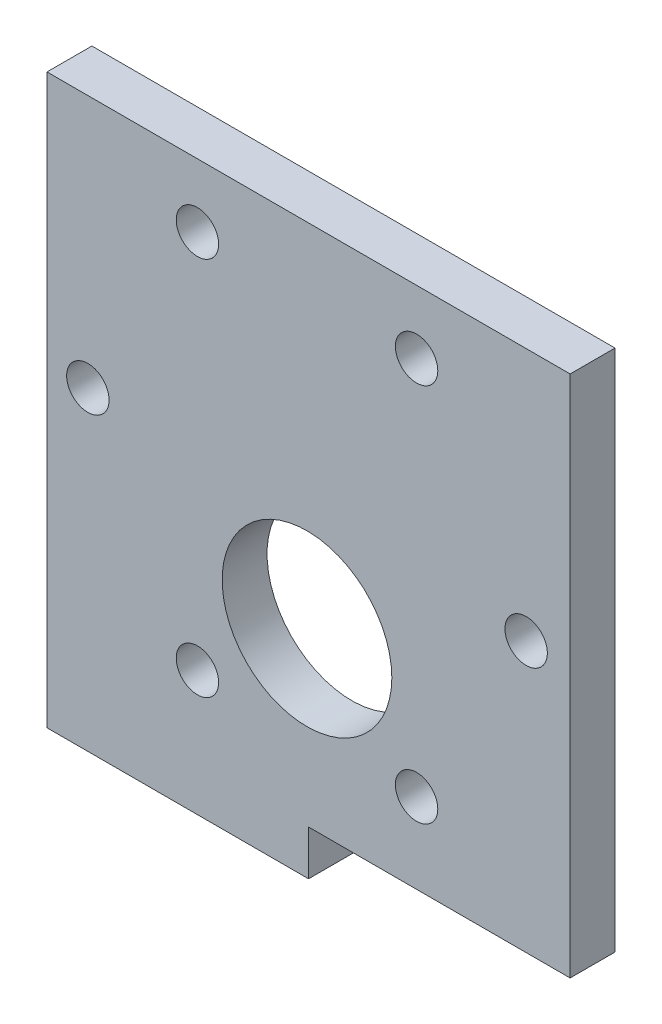
ISO-10303-21;
HEADER;
FILE_DESCRIPTION(('STEP AP214'),'2;1');
FILE_NAME('part.step','',(''),(''),'','','');
FILE_SCHEMA(('AUTOMOTIVE_DESIGN { 1 0 10303 214 1 1 1 1 }'));
ENDSEC;
DATA;
#1=APPLICATION_CONTEXT('core data for automotive mechanical design processes');
#2=APPLICATION_PROTOCOL_DEFINITION('international standard','automotive_design',2000,#1);
#3=PRODUCT_CONTEXT('',#1,'mechanical');
#4=PRODUCT('Part','Part','',(#3));
#5=PRODUCT_RELATED_PRODUCT_CATEGORY('part','',(#4));
#6=PRODUCT_DEFINITION_FORMATION('','',#4);
#7=PRODUCT_DEFINITION_CONTEXT('part definition',#1,'design');
#8=PRODUCT_DEFINITION('design','',#6,#7);
#9=PRODUCT_DEFINITION_SHAPE('','',#8);
#10=(LENGTH_UNIT() NAMED_UNIT(*) SI_UNIT(.MILLI.,.METRE.));
#11=(NAMED_UNIT(*) PLANE_ANGLE_UNIT() SI_UNIT($,.RADIAN.));
#12=(NAMED_UNIT(*) SI_UNIT($,.STERADIAN.) SOLID_ANGLE_UNIT());
#13=UNCERTAINTY_MEASURE_WITH_UNIT(LENGTH_MEASURE(1.E-05),#10,'distance_accuracy_value','');
#14=(GEOMETRIC_REPRESENTATION_CONTEXT(3) GLOBAL_UNCERTAINTY_ASSIGNED_CONTEXT((#13)) GLOBAL_UNIT_ASSIGNED_CONTEXT((#10,
#11,#12)) REPRESENTATION_CONTEXT('',''));
#15=CARTESIAN_POINT('',(0.,0.,0.));
#16=DIRECTION('',(0.,0.,1.));
#17=DIRECTION('',(1.,0.,0.));
#18=AXIS2_PLACEMENT_3D('',#15,#16,#17);
#19=CARTESIAN_POINT('',(0.,0.,3.175));
#20=DIRECTION('',(0.,0.,-1.));
#21=DIRECTION('',(-1.,0.,0.));
#22=AXIS2_PLACEMENT_3D('',#19,#20,#21);
#23=PLANE('',#22);
#24=DIRECTION('',(0.,-1.,0.));
#25=VECTOR('',#24,1.);
#26=CARTESIAN_POINT('',(0.,-3.175,3.175));
#27=LINE('',#26,#25);
#28=CARTESIAN_POINT('',(0.,37.,3.175));
#29=VERTEX_POINT('',#28);
#30=CARTESIAN_POINT('',(0.,-3.175,3.175));
#31=VERTEX_POINT('',#30);
#32=EDGE_CURVE('E57',#29,#31,#27,.T.);
#33=ORIENTED_EDGE('',*,*,#32,.T.);
#34=DIRECTION('',(1.,0.,0.));
#35=VECTOR('',#34,1.);
#36=CARTESIAN_POINT('',(18.5,-3.175,3.175));
#37=LINE('',#36,#35);
#38=CARTESIAN_POINT('',(18.5,-3.175,3.175));
#39=VERTEX_POINT('',#38);
#40=EDGE_CURVE('E95',#31,#39,#37,.T.);
#41=ORIENTED_EDGE('',*,*,#40,.T.);
#42=DIRECTION('',(0.,1.,0.));
#43=VECTOR('',#42,1.);
#44=CARTESIAN_POINT('',(18.5,0.,3.175));
#45=LINE('',#44,#43);
#46=CARTESIAN_POINT('',(18.5,0.,3.175));
#47=VERTEX_POINT('',#46);
#48=EDGE_CURVE('E109',#39,#47,#45,.T.);
#49=ORIENTED_EDGE('',*,*,#48,.T.);
#50=DIRECTION('',(1.,0.,0.));
#51=VECTOR('',#50,1.);
#52=CARTESIAN_POINT('',(18.5,0.,3.175));
#53=LINE('',#52,#51);
#54=CARTESIAN_POINT('',(37.,0.,3.175));
#55=VERTEX_POINT('',#54);
#56=EDGE_CURVE('E103',#47,#55,#53,.T.);
#57=ORIENTED_EDGE('',*,*,#56,.T.);
#58=DIRECTION('',(0.,1.,0.));
#59=VECTOR('',#58,1.);
#60=CARTESIAN_POINT('',(37.,0.,3.175));
#61=LINE('',#60,#59);
#62=CARTESIAN_POINT('',(37.,37.,3.175));
#63=VERTEX_POINT('',#62);
#64=EDGE_CURVE('E107',#55,#63,#61,.T.);
#65=ORIENTED_EDGE('',*,*,#64,.T.);
#66=DIRECTION('',(-1.,0.,0.));
#67=VECTOR('',#66,1.);
#68=CARTESIAN_POINT('',(0.,37.,3.175));
#69=LINE('',#68,#67);
#70=EDGE_CURVE('E126',#63,#29,#69,.T.);
#71=ORIENTED_EDGE('',*,*,#70,.T.);
#72=EDGE_LOOP('',(#33,#41,#49,#57,#65,#71));
#73=FACE_BOUND('',#72,.T.);
#74=CARTESIAN_POINT('',(18.3902331199689,12.0898739119919,3.175));
#75=DIRECTION('',(0.,0.,1.));
#76=DIRECTION('',(1.,0.,0.));
#77=AXIS2_PLACEMENT_3D('',#74,#75,#76);
#78=CIRCLE('',#77,6.00000000000002);
#79=CARTESIAN_POINT('',(24.3902331199689,12.0898739119919,3.175));
#80=VERTEX_POINT('',#79);
#81=EDGE_CURVE('E137',#80,#80,#78,.T.);
#82=ORIENTED_EDGE('',*,*,#81,.F.);
#83=EDGE_LOOP('',(#82));
#84=FACE_BOUND('',#83,.T.);
#85=CARTESIAN_POINT('',(2.89023311996889,19.089873911992,3.175));
#86=DIRECTION('',(0.,0.,1.));
#87=DIRECTION('',(1.,0.,0.));
#88=AXIS2_PLACEMENT_3D('',#85,#86,#87);
#89=CIRCLE('',#88,1.5);
#90=CARTESIAN_POINT('',(4.39023311996889,19.089873911992,3.175));
#91=VERTEX_POINT('',#90);
#92=EDGE_CURVE('E176',#91,#91,#89,.T.);
#93=ORIENTED_EDGE('',*,*,#92,.F.);
#94=EDGE_LOOP('',(#93));
#95=FACE_BOUND('',#94,.T.);
#96=CARTESIAN_POINT('',(10.6402331199689,5.66648015333317,3.175));
#97=DIRECTION('',(0.,0.,1.));
#98=DIRECTION('',(1.,0.,0.));
#99=AXIS2_PLACEMENT_3D('',#96,#97,#98);
#100=CIRCLE('',#99,1.5);
#101=CARTESIAN_POINT('',(12.1402331199689,5.66648015333317,3.175));
#102=VERTEX_POINT('',#101);
#103=EDGE_CURVE('E184',#102,#102,#100,.T.);
#104=ORIENTED_EDGE('',*,*,#103,.F.);
#105=EDGE_LOOP('',(#104));
#106=FACE_BOUND('',#105,.T.);
#107=CARTESIAN_POINT('',(26.1402331199689,5.66648015333317,3.175));
#108=DIRECTION('',(0.,0.,1.));
#109=DIRECTION('',(1.,0.,0.));
#110=AXIS2_PLACEMENT_3D('',#107,#108,#109);
#111=CIRCLE('',#110,1.5);
#112=CARTESIAN_POINT('',(27.6402331199689,5.66648015333317,3.175));
#113=VERTEX_POINT('',#112);
#114=EDGE_CURVE('E192',#113,#113,#111,.T.);
#115=ORIENTED_EDGE('',*,*,#114,.F.);
#116=EDGE_LOOP('',(#115));
#117=FACE_BOUND('',#116,.T.);
#118=CARTESIAN_POINT('',(33.8902331199689,19.089873911992,3.175));
#119=DIRECTION('',(0.,0.,1.));
#120=DIRECTION('',(1.,0.,0.));
#121=AXIS2_PLACEMENT_3D('',#118,#119,#120);
#122=CIRCLE('',#121,1.5);
#123=CARTESIAN_POINT('',(35.3902331199689,19.089873911992,3.175));
#124=VERTEX_POINT('',#123);
#125=EDGE_CURVE('E200',#124,#124,#122,.T.);
#126=ORIENTED_EDGE('',*,*,#125,.F.);
#127=EDGE_LOOP('',(#126));
#128=FACE_BOUND('',#127,.T.);
#129=CARTESIAN_POINT('',(26.1402331199689,32.5132676706507,3.175));
#130=DIRECTION('',(0.,0.,1.));
#131=DIRECTION('',(1.,0.,0.));
#132=AXIS2_PLACEMENT_3D('',#129,#130,#131);
#133=CIRCLE('',#132,1.5);
#134=CARTESIAN_POINT('',(27.6402331199689,32.5132676706507,3.175));
#135=VERTEX_POINT('',#134);
#136=EDGE_CURVE('E208',#135,#135,#133,.T.);
#137=ORIENTED_EDGE('',*,*,#136,.F.);
#138=EDGE_LOOP('',(#137));
#139=FACE_BOUND('',#138,.T.);
#140=CARTESIAN_POINT('',(10.6402331199689,32.5132676706507,3.175));
#141=DIRECTION('',(0.,0.,1.));
#142=DIRECTION('',(1.,0.,0.));
#143=AXIS2_PLACEMENT_3D('',#140,#141,#142);
#144=CIRCLE('',#143,1.5);
#145=CARTESIAN_POINT('',(12.1402331199689,32.5132676706507,3.175));
#146=VERTEX_POINT('',#145);
#147=EDGE_CURVE('E216',#146,#146,#144,.T.);
#148=ORIENTED_EDGE('',*,*,#147,.F.);
#149=EDGE_LOOP('',(#148));
#150=FACE_BOUND('',#149,.T.);
#151=ADVANCED_FACE('F39',(#73,#84,#95,#106,#117,#128,#139,#150),#23,.F.);
#152=CARTESIAN_POINT('',(0.,0.,0.));
#153=DIRECTION('',(0.,0.,-1.));
#154=DIRECTION('',(-1.,0.,0.));
#155=AXIS2_PLACEMENT_3D('',#152,#153,#154);
#156=PLANE('',#155);
#157=CARTESIAN_POINT('',(26.1402331199689,32.5132676706507,0.));
#158=DIRECTION('',(0.,0.,1.));
#159=DIRECTION('',(1.,0.,0.));
#160=AXIS2_PLACEMENT_3D('',#157,#158,#159);
#161=CIRCLE('',#160,1.5);
#162=CARTESIAN_POINT('',(27.6402331199689,32.5132676706507,0.));
#163=VERTEX_POINT('',#162);
#164=EDGE_CURVE('E212',#163,#163,#161,.T.);
#165=ORIENTED_EDGE('',*,*,#164,.T.);
#166=EDGE_LOOP('',(#165));
#167=FACE_BOUND('',#166,.T.);
#168=CARTESIAN_POINT('',(26.1402331199689,5.66648015333317,0.));
#169=DIRECTION('',(0.,0.,1.));
#170=DIRECTION('',(1.,0.,0.));
#171=AXIS2_PLACEMENT_3D('',#168,#169,#170);
#172=CIRCLE('',#171,1.5);
#173=CARTESIAN_POINT('',(27.6402331199689,5.66648015333317,0.));
#174=VERTEX_POINT('',#173);
#175=EDGE_CURVE('E196',#174,#174,#172,.T.);
#176=ORIENTED_EDGE('',*,*,#175,.T.);
#177=EDGE_LOOP('',(#176));
#178=FACE_BOUND('',#177,.T.);
#179=CARTESIAN_POINT('',(2.89023311996889,19.089873911992,0.));
#180=DIRECTION('',(0.,0.,1.));
#181=DIRECTION('',(1.,0.,0.));
#182=AXIS2_PLACEMENT_3D('',#179,#180,#181);
#183=CIRCLE('',#182,1.5);
#184=CARTESIAN_POINT('',(4.39023311996889,19.089873911992,0.));
#185=VERTEX_POINT('',#184);
#186=EDGE_CURVE('E180',#185,#185,#183,.T.);
#187=ORIENTED_EDGE('',*,*,#186,.T.);
#188=EDGE_LOOP('',(#187));
#189=FACE_BOUND('',#188,.T.);
#190=DIRECTION('',(1.,0.,0.));
#191=VECTOR('',#190,1.);
#192=CARTESIAN_POINT('',(18.5,-3.175,0.));
#193=LINE('',#192,#191);
#194=CARTESIAN_POINT('',(0.,-3.175,0.));
#195=VERTEX_POINT('',#194);
#196=CARTESIAN_POINT('',(18.5,-3.175,0.));
#197=VERTEX_POINT('',#196);
#198=EDGE_CURVE('E133',#195,#197,#193,.T.);
#199=ORIENTED_EDGE('',*,*,#198,.F.);
#200=DIRECTION('',(0.,-1.,0.));
#201=VECTOR('',#200,1.);
#202=CARTESIAN_POINT('',(0.,0.,0.));
#203=LINE('',#202,#201);
#204=CARTESIAN_POINT('',(0.,37.,0.));
#205=VERTEX_POINT('',#204);
#206=EDGE_CURVE('E146',#205,#195,#203,.T.);
#207=ORIENTED_EDGE('',*,*,#206,.F.);
#208=DIRECTION('',(-1.,0.,0.));
#209=VECTOR('',#208,1.);
#210=CARTESIAN_POINT('',(0.,37.,0.));
#211=LINE('',#210,#209);
#212=CARTESIAN_POINT('',(37.,37.,0.));
#213=VERTEX_POINT('',#212);
#214=EDGE_CURVE('E88',#213,#205,#211,.T.);
#215=ORIENTED_EDGE('',*,*,#214,.F.);
#216=DIRECTION('',(0.,1.,0.));
#217=VECTOR('',#216,1.);
#218=CARTESIAN_POINT('',(37.,0.,0.));
#219=LINE('',#218,#217);
#220=CARTESIAN_POINT('',(37.,0.,0.));
#221=VERTEX_POINT('',#220);
#222=EDGE_CURVE('E81',#221,#213,#219,.T.);
#223=ORIENTED_EDGE('',*,*,#222,.F.);
#224=DIRECTION('',(1.,0.,0.));
#225=VECTOR('',#224,1.);
#226=CARTESIAN_POINT('',(18.5,0.,0.));
#227=LINE('',#226,#225);
#228=CARTESIAN_POINT('',(18.5,0.,0.));
#229=VERTEX_POINT('',#228);
#230=EDGE_CURVE('E118',#229,#221,#227,.T.);
#231=ORIENTED_EDGE('',*,*,#230,.F.);
#232=DIRECTION('',(0.,1.,0.));
#233=VECTOR('',#232,1.);
#234=CARTESIAN_POINT('',(18.5,0.,0.));
#235=LINE('',#234,#233);
#236=EDGE_CURVE('E136',#197,#229,#235,.T.);
#237=ORIENTED_EDGE('',*,*,#236,.F.);
#238=EDGE_LOOP('',(#199,#207,#215,#223,#231,#237));
#239=FACE_BOUND('',#238,.T.);
#240=CARTESIAN_POINT('',(18.3902331199689,12.0898739119919,0.));
#241=DIRECTION('',(0.,0.,1.));
#242=DIRECTION('',(1.,0.,0.));
#243=AXIS2_PLACEMENT_3D('',#240,#241,#242);
#244=CIRCLE('',#243,6.00000000000002);
#245=CARTESIAN_POINT('',(24.3902331199689,12.0898739119919,0.));
#246=VERTEX_POINT('',#245);
#247=EDGE_CURVE('E171',#246,#246,#244,.T.);
#248=ORIENTED_EDGE('',*,*,#247,.T.);
#249=EDGE_LOOP('',(#248));
#250=FACE_BOUND('',#249,.T.);
#251=CARTESIAN_POINT('',(10.6402331199689,5.66648015333317,0.));
#252=DIRECTION('',(0.,0.,1.));
#253=DIRECTION('',(1.,0.,0.));
#254=AXIS2_PLACEMENT_3D('',#251,#252,#253);
#255=CIRCLE('',#254,1.5);
#256=CARTESIAN_POINT('',(12.1402331199689,5.66648015333317,0.));
#257=VERTEX_POINT('',#256);
#258=EDGE_CURVE('E188',#257,#257,#255,.T.);
#259=ORIENTED_EDGE('',*,*,#258,.T.);
#260=EDGE_LOOP('',(#259));
#261=FACE_BOUND('',#260,.T.);
#262=CARTESIAN_POINT('',(33.8902331199689,19.089873911992,0.));
#263=DIRECTION('',(0.,0.,1.));
#264=DIRECTION('',(1.,0.,0.));
#265=AXIS2_PLACEMENT_3D('',#262,#263,#264);
#266=CIRCLE('',#265,1.5);
#267=CARTESIAN_POINT('',(35.3902331199689,19.089873911992,0.));
#268=VERTEX_POINT('',#267);
#269=EDGE_CURVE('E204',#268,#268,#266,.T.);
#270=ORIENTED_EDGE('',*,*,#269,.T.);
#271=EDGE_LOOP('',(#270));
#272=FACE_BOUND('',#271,.T.);
#273=CARTESIAN_POINT('',(10.6402331199689,32.5132676706507,0.));
#274=DIRECTION('',(0.,0.,1.));
#275=DIRECTION('',(1.,0.,0.));
#276=AXIS2_PLACEMENT_3D('',#273,#274,#275);
#277=CIRCLE('',#276,1.5);
#278=CARTESIAN_POINT('',(12.1402331199689,32.5132676706507,0.));
#279=VERTEX_POINT('',#278);
#280=EDGE_CURVE('E220',#279,#279,#277,.T.);
#281=ORIENTED_EDGE('',*,*,#280,.T.);
#282=EDGE_LOOP('',(#281));
#283=FACE_BOUND('',#282,.T.);
#284=ADVANCED_FACE('F161',(#167,#178,#189,#239,#250,#261,#272,#283),#156,.T.);
#285=CARTESIAN_POINT('',(18.5,-3.175,3.175));
#286=DIRECTION('',(0.,1.,0.));
#287=DIRECTION('',(-1.,0.,0.));
#288=AXIS2_PLACEMENT_3D('',#285,#286,#287);
#289=PLANE('',#288);
#290=ORIENTED_EDGE('',*,*,#198,.T.);
#291=DIRECTION('',(0.,0.,-1.));
#292=VECTOR('',#291,1.);
#293=CARTESIAN_POINT('',(18.5,-3.175,3.175));
#294=LINE('',#293,#292);
#295=EDGE_CURVE('E49',#39,#197,#294,.T.);
#296=ORIENTED_EDGE('',*,*,#295,.F.);
#297=ORIENTED_EDGE('',*,*,#40,.F.);
#298=DIRECTION('',(0.,0.,-1.));
#299=VECTOR('',#298,1.);
#300=CARTESIAN_POINT('',(0.,-3.175,3.175));
#301=LINE('',#300,#299);
#302=EDGE_CURVE('E11',#31,#195,#301,.T.);
#303=ORIENTED_EDGE('',*,*,#302,.T.);
#304=EDGE_LOOP('',(#290,#296,#297,#303));
#305=FACE_BOUND('',#304,.T.);
#306=ADVANCED_FACE('F41',(#305),#289,.F.);
#307=CARTESIAN_POINT('',(18.5,0.,3.175));
#308=DIRECTION('',(-1.,0.,0.));
#309=DIRECTION('',(0.,0.,1.));
#310=AXIS2_PLACEMENT_3D('',#307,#308,#309);
#311=PLANE('',#310);
#312=ORIENTED_EDGE('',*,*,#236,.T.);
#313=DIRECTION('',(0.,0.,-1.));
#314=VECTOR('',#313,1.);
#315=CARTESIAN_POINT('',(18.5,0.,3.175));
#316=LINE('',#315,#314);
#317=EDGE_CURVE('E120',#47,#229,#316,.T.);
#318=ORIENTED_EDGE('',*,*,#317,.F.);
#319=ORIENTED_EDGE('',*,*,#48,.F.);
#320=ORIENTED_EDGE('',*,*,#295,.T.);
#321=EDGE_LOOP('',(#312,#318,#319,#320));
#322=FACE_BOUND('',#321,.T.);
#323=ADVANCED_FACE('F158',(#322),#311,.F.);
#324=CARTESIAN_POINT('',(18.5,0.,3.175));
#325=DIRECTION('',(0.,1.,0.));
#326=DIRECTION('',(-1.,0.,0.));
#327=AXIS2_PLACEMENT_3D('',#324,#325,#326);
#328=PLANE('',#327);
#329=ORIENTED_EDGE('',*,*,#230,.T.);
#330=DIRECTION('',(0.,0.,-1.));
#331=VECTOR('',#330,1.);
#332=CARTESIAN_POINT('',(37.,0.,3.175));
#333=LINE('',#332,#331);
#334=EDGE_CURVE('E115',#55,#221,#333,.T.);
#335=ORIENTED_EDGE('',*,*,#334,.F.);
#336=ORIENTED_EDGE('',*,*,#56,.F.);
#337=ORIENTED_EDGE('',*,*,#317,.T.);
#338=EDGE_LOOP('',(#329,#335,#336,#337));
#339=FACE_BOUND('',#338,.T.);
#340=ADVANCED_FACE('F116',(#339),#328,.F.);
#341=CARTESIAN_POINT('',(37.,0.,3.175));
#342=DIRECTION('',(-1.,0.,0.));
#343=DIRECTION('',(0.,0.,1.));
#344=AXIS2_PLACEMENT_3D('',#341,#342,#343);
#345=PLANE('',#344);
#346=ORIENTED_EDGE('',*,*,#222,.T.);
#347=DIRECTION('',(0.,0.,-1.));
#348=VECTOR('',#347,1.);
#349=CARTESIAN_POINT('',(37.,37.,3.175));
#350=LINE('',#349,#348);
#351=EDGE_CURVE('E121',#63,#213,#350,.T.);
#352=ORIENTED_EDGE('',*,*,#351,.F.);
#353=ORIENTED_EDGE('',*,*,#64,.F.);
#354=ORIENTED_EDGE('',*,*,#334,.T.);
#355=EDGE_LOOP('',(#346,#352,#353,#354));
#356=FACE_BOUND('',#355,.T.);
#357=ADVANCED_FACE('F123',(#356),#345,.F.);
#358=CARTESIAN_POINT('',(0.,37.,3.175));
#359=DIRECTION('',(0.,-1.,0.));
#360=DIRECTION('',(0.,0.,-1.));
#361=AXIS2_PLACEMENT_3D('',#358,#359,#360);
#362=PLANE('',#361);
#363=ORIENTED_EDGE('',*,*,#214,.T.);
#364=DIRECTION('',(0.,0.,-1.));
#365=VECTOR('',#364,1.);
#366=CARTESIAN_POINT('',(0.,37.,3.175));
#367=LINE('',#366,#365);
#368=EDGE_CURVE('E129',#29,#205,#367,.T.);
#369=ORIENTED_EDGE('',*,*,#368,.F.);
#370=ORIENTED_EDGE('',*,*,#70,.F.);
#371=ORIENTED_EDGE('',*,*,#351,.T.);
#372=EDGE_LOOP('',(#363,#369,#370,#371));
#373=FACE_BOUND('',#372,.T.);
#374=ADVANCED_FACE('F165',(#373),#362,.F.);
#375=CARTESIAN_POINT('',(0.,0.,3.175));
#376=DIRECTION('',(1.,0.,0.));
#377=DIRECTION('',(0.,0.,-1.));
#378=AXIS2_PLACEMENT_3D('',#375,#376,#377);
#379=PLANE('',#378);
#380=ORIENTED_EDGE('',*,*,#206,.T.);
#381=ORIENTED_EDGE('',*,*,#302,.F.);
#382=ORIENTED_EDGE('',*,*,#32,.F.);
#383=ORIENTED_EDGE('',*,*,#368,.T.);
#384=EDGE_LOOP('',(#380,#381,#382,#383));
#385=FACE_BOUND('',#384,.T.);
#386=ADVANCED_FACE('F164',(#385),#379,.F.);
#387=CARTESIAN_POINT('',(18.3902331199689,12.0898739119919,3.175));
#388=DIRECTION('',(0.,0.,-1.));
#389=DIRECTION('',(-1.,0.,0.));
#390=AXIS2_PLACEMENT_3D('',#387,#388,#389);
#391=CYLINDRICAL_SURFACE('',#390,6.00000000000002);
#392=ORIENTED_EDGE('',*,*,#81,.T.);
#393=EDGE_LOOP('',(#392));
#394=FACE_BOUND('',#393,.T.);
#395=ORIENTED_EDGE('',*,*,#247,.F.);
#396=EDGE_LOOP('',(#395));
#397=FACE_BOUND('',#396,.T.);
#398=ADVANCED_FACE('F239',(#394,#397),#391,.F.);
#399=CARTESIAN_POINT('',(2.89023311996889,19.089873911992,3.175));
#400=DIRECTION('',(0.,0.,-1.));
#401=DIRECTION('',(-1.,0.,0.));
#402=AXIS2_PLACEMENT_3D('',#399,#400,#401);
#403=CYLINDRICAL_SURFACE('',#402,1.5);
#404=ORIENTED_EDGE('',*,*,#92,.T.);
#405=EDGE_LOOP('',(#404));
#406=FACE_BOUND('',#405,.T.);
#407=ORIENTED_EDGE('',*,*,#186,.F.);
#408=EDGE_LOOP('',(#407));
#409=FACE_BOUND('',#408,.T.);
#410=ADVANCED_FACE('F302',(#406,#409),#403,.F.);
#411=CARTESIAN_POINT('',(10.6402331199689,5.66648015333317,3.175));
#412=DIRECTION('',(0.,0.,-1.));
#413=DIRECTION('',(-1.,0.,0.));
#414=AXIS2_PLACEMENT_3D('',#411,#412,#413);
#415=CYLINDRICAL_SURFACE('',#414,1.5);
#416=ORIENTED_EDGE('',*,*,#103,.T.);
#417=EDGE_LOOP('',(#416));
#418=FACE_BOUND('',#417,.T.);
#419=ORIENTED_EDGE('',*,*,#258,.F.);
#420=EDGE_LOOP('',(#419));
#421=FACE_BOUND('',#420,.T.);
#422=ADVANCED_FACE('F310',(#418,#421),#415,.F.);
#423=CARTESIAN_POINT('',(26.1402331199689,5.66648015333317,3.175));
#424=DIRECTION('',(0.,0.,-1.));
#425=DIRECTION('',(-1.,0.,0.));
#426=AXIS2_PLACEMENT_3D('',#423,#424,#425);
#427=CYLINDRICAL_SURFACE('',#426,1.5);
#428=ORIENTED_EDGE('',*,*,#114,.T.);
#429=EDGE_LOOP('',(#428));
#430=FACE_BOUND('',#429,.T.);
#431=ORIENTED_EDGE('',*,*,#175,.F.);
#432=EDGE_LOOP('',(#431));
#433=FACE_BOUND('',#432,.T.);
#434=ADVANCED_FACE('F318',(#430,#433),#427,.F.);
#435=CARTESIAN_POINT('',(33.8902331199689,19.089873911992,3.175));
#436=DIRECTION('',(0.,0.,-1.));
#437=DIRECTION('',(-1.,0.,0.));
#438=AXIS2_PLACEMENT_3D('',#435,#436,#437);
#439=CYLINDRICAL_SURFACE('',#438,1.5);
#440=ORIENTED_EDGE('',*,*,#125,.T.);
#441=EDGE_LOOP('',(#440));
#442=FACE_BOUND('',#441,.T.);
#443=ORIENTED_EDGE('',*,*,#269,.F.);
#444=EDGE_LOOP('',(#443));
#445=FACE_BOUND('',#444,.T.);
#446=ADVANCED_FACE('F327',(#442,#445),#439,.F.);
#447=CARTESIAN_POINT('',(26.1402331199689,32.5132676706507,3.175));
#448=DIRECTION('',(0.,0.,-1.));
#449=DIRECTION('',(-1.,0.,0.));
#450=AXIS2_PLACEMENT_3D('',#447,#448,#449);
#451=CYLINDRICAL_SURFACE('',#450,1.5);
#452=ORIENTED_EDGE('',*,*,#136,.T.);
#453=EDGE_LOOP('',(#452));
#454=FACE_BOUND('',#453,.T.);
#455=ORIENTED_EDGE('',*,*,#164,.F.);
#456=EDGE_LOOP('',(#455));
#457=FACE_BOUND('',#456,.T.);
#458=ADVANCED_FACE('F336',(#454,#457),#451,.F.);
#459=CARTESIAN_POINT('',(10.6402331199689,32.5132676706507,3.175));
#460=DIRECTION('',(0.,0.,-1.));
#461=DIRECTION('',(-1.,0.,0.));
#462=AXIS2_PLACEMENT_3D('',#459,#460,#461);
#463=CYLINDRICAL_SURFACE('',#462,1.5);
#464=ORIENTED_EDGE('',*,*,#147,.T.);
#465=EDGE_LOOP('',(#464));
#466=FACE_BOUND('',#465,.T.);
#467=ORIENTED_EDGE('',*,*,#280,.F.);
#468=EDGE_LOOP('',(#467));
#469=FACE_BOUND('',#468,.T.);
#470=ADVANCED_FACE('F228',(#466,#469),#463,.F.);
#471=CLOSED_SHELL('',(#151,#284,#306,#323,#340,#357,#374,#386,#398,#410,#422,#434,#446,#458,#470));
#472=MANIFOLD_SOLID_BREP('B2',#471);
#473=ADVANCED_BREP_SHAPE_REPRESENTATION('',(#18,#472),#14);
#474=SHAPE_DEFINITION_REPRESENTATION(#9,#473);
ENDSEC;
END-ISO-10303-21;
